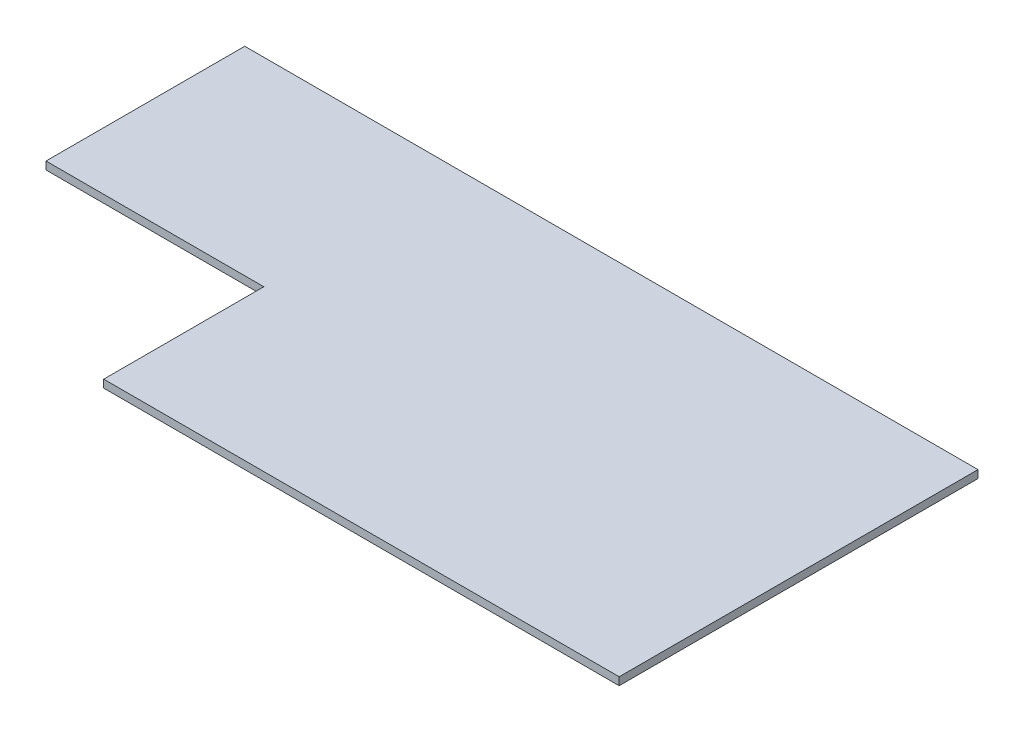
ISO-10303-21;
HEADER;
FILE_DESCRIPTION(('STEP AP214'),'2;1');
FILE_NAME('part.step','',(''),(''),'','','');
FILE_SCHEMA(('AUTOMOTIVE_DESIGN { 1 0 10303 214 1 1 1 1 }'));
ENDSEC;
DATA;
#1=APPLICATION_CONTEXT('core data for automotive mechanical design processes');
#2=APPLICATION_PROTOCOL_DEFINITION('international standard','automotive_design',2000,#1);
#3=PRODUCT_CONTEXT('',#1,'mechanical');
#4=PRODUCT('Part','Part','',(#3));
#5=PRODUCT_RELATED_PRODUCT_CATEGORY('part','',(#4));
#6=PRODUCT_DEFINITION_FORMATION('','',#4);
#7=PRODUCT_DEFINITION_CONTEXT('part definition',#1,'design');
#8=PRODUCT_DEFINITION('design','',#6,#7);
#9=PRODUCT_DEFINITION_SHAPE('','',#8);
#10=(LENGTH_UNIT() NAMED_UNIT(*) SI_UNIT(.MILLI.,.METRE.));
#11=(NAMED_UNIT(*) PLANE_ANGLE_UNIT() SI_UNIT($,.RADIAN.));
#12=(NAMED_UNIT(*) SI_UNIT($,.STERADIAN.) SOLID_ANGLE_UNIT());
#13=UNCERTAINTY_MEASURE_WITH_UNIT(LENGTH_MEASURE(1.E-05),#10,'distance_accuracy_value','');
#14=(GEOMETRIC_REPRESENTATION_CONTEXT(3) GLOBAL_UNCERTAINTY_ASSIGNED_CONTEXT((#13)) GLOBAL_UNIT_ASSIGNED_CONTEXT((#10,
#11,#12)) REPRESENTATION_CONTEXT('',''));
#15=CARTESIAN_POINT('',(0.,0.,0.));
#16=DIRECTION('',(0.,0.,1.));
#17=DIRECTION('',(1.,0.,0.));
#18=AXIS2_PLACEMENT_3D('',#15,#16,#17);
#19=CARTESIAN_POINT('',(296.021061623797,3.175,144.861370581858));
#20=DIRECTION('',(-1.,0.,0.));
#21=DIRECTION('',(0.,0.,1.));
#22=AXIS2_PLACEMENT_3D('',#19,#20,#21);
#23=PLANE('',#22);
#24=DIRECTION('',(0.,0.,-1.));
#25=VECTOR('',#24,1.);
#26=CARTESIAN_POINT('',(296.021061623797,-3.175,144.861370581858));
#27=LINE('',#26,#25);
#28=CARTESIAN_POINT('',(296.021061623797,-3.175,144.861370581858));
#29=VERTEX_POINT('',#28);
#30=CARTESIAN_POINT('',(296.021061623797,-3.175,-147.238629418142));
#31=VERTEX_POINT('',#30);
#32=EDGE_CURVE('E123',#29,#31,#27,.T.);
#33=ORIENTED_EDGE('',*,*,#32,.T.);
#34=DIRECTION('',(0.,-1.,0.));
#35=VECTOR('',#34,1.);
#36=CARTESIAN_POINT('',(296.021061623797,3.175,-147.238629418142));
#37=LINE('',#36,#35);
#38=CARTESIAN_POINT('',(296.021061623797,3.175,-147.238629418142));
#39=VERTEX_POINT('',#38);
#40=EDGE_CURVE('E11',#39,#31,#37,.T.);
#41=ORIENTED_EDGE('',*,*,#40,.F.);
#42=DIRECTION('',(0.,0.,-1.));
#43=VECTOR('',#42,1.);
#44=CARTESIAN_POINT('',(296.021061623797,3.175,144.861370581858));
#45=LINE('',#44,#43);
#46=CARTESIAN_POINT('',(296.021061623797,3.175,144.861370581858));
#47=VERTEX_POINT('',#46);
#48=EDGE_CURVE('E133',#47,#39,#45,.T.);
#49=ORIENTED_EDGE('',*,*,#48,.F.);
#50=DIRECTION('',(0.,-1.,0.));
#51=VECTOR('',#50,1.);
#52=CARTESIAN_POINT('',(296.021061623797,3.175,144.861370581858));
#53=LINE('',#52,#51);
#54=EDGE_CURVE('E119',#47,#29,#53,.T.);
#55=ORIENTED_EDGE('',*,*,#54,.T.);
#56=EDGE_LOOP('',(#33,#41,#49,#55));
#57=FACE_BOUND('',#56,.T.);
#58=ADVANCED_FACE('F39',(#57),#23,.F.);
#59=CARTESIAN_POINT('',(-300.878938376203,3.175,-147.238629418142));
#60=DIRECTION('',(0.,0.,1.));
#61=DIRECTION('',(1.,0.,0.));
#62=AXIS2_PLACEMENT_3D('',#59,#60,#61);
#63=PLANE('',#62);
#64=DIRECTION('',(-1.,0.,0.));
#65=VECTOR('',#64,1.);
#66=CARTESIAN_POINT('',(-300.878938376203,-3.175,-147.238629418142));
#67=LINE('',#66,#65);
#68=CARTESIAN_POINT('',(-300.878938376203,-3.175,-147.238629418142));
#69=VERTEX_POINT('',#68);
#70=EDGE_CURVE('E126',#31,#69,#67,.T.);
#71=ORIENTED_EDGE('',*,*,#70,.T.);
#72=DIRECTION('',(0.,-1.,0.));
#73=VECTOR('',#72,1.);
#74=CARTESIAN_POINT('',(-300.878938376203,3.175,-147.238629418142));
#75=LINE('',#74,#73);
#76=CARTESIAN_POINT('',(-300.878938376203,3.175,-147.238629418142));
#77=VERTEX_POINT('',#76);
#78=EDGE_CURVE('E47',#77,#69,#75,.T.);
#79=ORIENTED_EDGE('',*,*,#78,.F.);
#80=DIRECTION('',(-1.,0.,0.));
#81=VECTOR('',#80,1.);
#82=CARTESIAN_POINT('',(-300.878938376203,3.175,-147.238629418142));
#83=LINE('',#82,#81);
#84=EDGE_CURVE('E92',#39,#77,#83,.T.);
#85=ORIENTED_EDGE('',*,*,#84,.F.);
#86=ORIENTED_EDGE('',*,*,#40,.T.);
#87=EDGE_LOOP('',(#71,#79,#85,#86));
#88=FACE_BOUND('',#87,.T.);
#89=ADVANCED_FACE('F157',(#88),#63,.F.);
#90=CARTESIAN_POINT('',(-300.878938376203,3.175,14.5593705818583));
#91=DIRECTION('',(1.,0.,0.));
#92=DIRECTION('',(0.,0.,-1.));
#93=AXIS2_PLACEMENT_3D('',#90,#91,#92);
#94=PLANE('',#93);
#95=DIRECTION('',(0.,0.,1.));
#96=VECTOR('',#95,1.);
#97=CARTESIAN_POINT('',(-300.878938376203,-3.175,14.5593705818583));
#98=LINE('',#97,#96);
#99=CARTESIAN_POINT('',(-300.878938376203,-3.175,14.5593705818583));
#100=VERTEX_POINT('',#99);
#101=EDGE_CURVE('E128',#69,#100,#98,.T.);
#102=ORIENTED_EDGE('',*,*,#101,.T.);
#103=DIRECTION('',(0.,-1.,0.));
#104=VECTOR('',#103,1.);
#105=CARTESIAN_POINT('',(-300.878938376203,3.175,14.5593705818583));
#106=LINE('',#105,#104);
#107=CARTESIAN_POINT('',(-300.878938376203,3.175,14.5593705818583));
#108=VERTEX_POINT('',#107);
#109=EDGE_CURVE('E114',#108,#100,#106,.T.);
#110=ORIENTED_EDGE('',*,*,#109,.F.);
#111=DIRECTION('',(0.,0.,1.));
#112=VECTOR('',#111,1.);
#113=CARTESIAN_POINT('',(-300.878938376203,3.175,14.5593705818583));
#114=LINE('',#113,#112);
#115=EDGE_CURVE('E105',#77,#108,#114,.T.);
#116=ORIENTED_EDGE('',*,*,#115,.F.);
#117=ORIENTED_EDGE('',*,*,#78,.T.);
#118=EDGE_LOOP('',(#102,#110,#116,#117));
#119=FACE_BOUND('',#118,.T.);
#120=ADVANCED_FACE('F139',(#119),#94,.F.);
#121=CARTESIAN_POINT('',(-300.878938376203,3.175,14.5593705818583));
#122=DIRECTION('',(0.,0.,-1.));
#123=DIRECTION('',(-1.,0.,0.));
#124=AXIS2_PLACEMENT_3D('',#121,#122,#123);
#125=PLANE('',#124);
#126=DIRECTION('',(1.,0.,0.));
#127=VECTOR('',#126,1.);
#128=CARTESIAN_POINT('',(-300.878938376203,-3.175,14.5593705818583));
#129=LINE('',#128,#127);
#130=CARTESIAN_POINT('',(-123.586938376203,-3.175,14.5593705818583));
#131=VERTEX_POINT('',#130);
#132=EDGE_CURVE('E113',#100,#131,#129,.T.);
#133=ORIENTED_EDGE('',*,*,#132,.T.);
#134=DIRECTION('',(0.,-1.,0.));
#135=VECTOR('',#134,1.);
#136=CARTESIAN_POINT('',(-123.586938376203,3.175,14.5593705818583));
#137=LINE('',#136,#135);
#138=CARTESIAN_POINT('',(-123.586938376203,3.175,14.5593705818583));
#139=VERTEX_POINT('',#138);
#140=EDGE_CURVE('E110',#139,#131,#137,.T.);
#141=ORIENTED_EDGE('',*,*,#140,.F.);
#142=DIRECTION('',(1.,0.,0.));
#143=VECTOR('',#142,1.);
#144=CARTESIAN_POINT('',(-300.878938376203,3.175,14.5593705818583));
#145=LINE('',#144,#143);
#146=EDGE_CURVE('E99',#108,#139,#145,.T.);
#147=ORIENTED_EDGE('',*,*,#146,.F.);
#148=ORIENTED_EDGE('',*,*,#109,.T.);
#149=EDGE_LOOP('',(#133,#141,#147,#148));
#150=FACE_BOUND('',#149,.T.);
#151=ADVANCED_FACE('F111',(#150),#125,.F.);
#152=CARTESIAN_POINT('',(-123.586938376203,3.175,144.861370581858));
#153=DIRECTION('',(1.,0.,0.));
#154=DIRECTION('',(0.,0.,-1.));
#155=AXIS2_PLACEMENT_3D('',#152,#153,#154);
#156=PLANE('',#155);
#157=DIRECTION('',(0.,0.,1.));
#158=VECTOR('',#157,1.);
#159=CARTESIAN_POINT('',(-123.586938376203,-3.175,144.861370581858));
#160=LINE('',#159,#158);
#161=CARTESIAN_POINT('',(-123.586938376203,-3.175,144.861370581858));
#162=VERTEX_POINT('',#161);
#163=EDGE_CURVE('E78',#131,#162,#160,.T.);
#164=ORIENTED_EDGE('',*,*,#163,.T.);
#165=DIRECTION('',(0.,-1.,0.));
#166=VECTOR('',#165,1.);
#167=CARTESIAN_POINT('',(-123.586938376203,3.175,144.861370581858));
#168=LINE('',#167,#166);
#169=CARTESIAN_POINT('',(-123.586938376203,3.175,144.861370581858));
#170=VERTEX_POINT('',#169);
#171=EDGE_CURVE('E115',#170,#162,#168,.T.);
#172=ORIENTED_EDGE('',*,*,#171,.F.);
#173=DIRECTION('',(0.,0.,1.));
#174=VECTOR('',#173,1.);
#175=CARTESIAN_POINT('',(-123.586938376203,3.175,144.861370581858));
#176=LINE('',#175,#174);
#177=EDGE_CURVE('E103',#139,#170,#176,.T.);
#178=ORIENTED_EDGE('',*,*,#177,.F.);
#179=ORIENTED_EDGE('',*,*,#140,.T.);
#180=EDGE_LOOP('',(#164,#172,#178,#179));
#181=FACE_BOUND('',#180,.T.);
#182=ADVANCED_FACE('F117',(#181),#156,.F.);
#183=CARTESIAN_POINT('',(-123.586938376203,3.175,144.861370581858));
#184=DIRECTION('',(0.,0.,-1.));
#185=DIRECTION('',(-1.,0.,0.));
#186=AXIS2_PLACEMENT_3D('',#183,#184,#185);
#187=PLANE('',#186);
#188=DIRECTION('',(1.,0.,0.));
#189=VECTOR('',#188,1.);
#190=CARTESIAN_POINT('',(-123.586938376203,-3.175,144.861370581858));
#191=LINE('',#190,#189);
#192=EDGE_CURVE('E84',#162,#29,#191,.T.);
#193=ORIENTED_EDGE('',*,*,#192,.T.);
#194=ORIENTED_EDGE('',*,*,#54,.F.);
#195=DIRECTION('',(1.,0.,0.));
#196=VECTOR('',#195,1.);
#197=CARTESIAN_POINT('',(-123.586938376203,3.175,144.861370581858));
#198=LINE('',#197,#196);
#199=EDGE_CURVE('E55',#170,#47,#198,.T.);
#200=ORIENTED_EDGE('',*,*,#199,.F.);
#201=ORIENTED_EDGE('',*,*,#171,.T.);
#202=EDGE_LOOP('',(#193,#194,#200,#201));
#203=FACE_BOUND('',#202,.T.);
#204=ADVANCED_FACE('F146',(#203),#187,.F.);
#205=CARTESIAN_POINT('',(0.,3.175,0.));
#206=DIRECTION('',(0.,-1.,0.));
#207=DIRECTION('',(0.,0.,-1.));
#208=AXIS2_PLACEMENT_3D('',#205,#206,#207);
#209=PLANE('',#208);
#210=ORIENTED_EDGE('',*,*,#48,.T.);
#211=ORIENTED_EDGE('',*,*,#84,.T.);
#212=ORIENTED_EDGE('',*,*,#115,.T.);
#213=ORIENTED_EDGE('',*,*,#146,.T.);
#214=ORIENTED_EDGE('',*,*,#177,.T.);
#215=ORIENTED_EDGE('',*,*,#199,.T.);
#216=EDGE_LOOP('',(#210,#211,#212,#213,#214,#215));
#217=FACE_BOUND('',#216,.T.);
#218=ADVANCED_FACE('F101',(#217),#209,.F.);
#219=CARTESIAN_POINT('',(0.,-3.175,0.));
#220=DIRECTION('',(0.,-1.,0.));
#221=DIRECTION('',(0.,0.,-1.));
#222=AXIS2_PLACEMENT_3D('',#219,#220,#221);
#223=PLANE('',#222);
#224=ORIENTED_EDGE('',*,*,#32,.F.);
#225=ORIENTED_EDGE('',*,*,#192,.F.);
#226=ORIENTED_EDGE('',*,*,#163,.F.);
#227=ORIENTED_EDGE('',*,*,#132,.F.);
#228=ORIENTED_EDGE('',*,*,#101,.F.);
#229=ORIENTED_EDGE('',*,*,#70,.F.);
#230=EDGE_LOOP('',(#224,#225,#226,#227,#228,#229));
#231=FACE_BOUND('',#230,.T.);
#232=ADVANCED_FACE('F142',(#231),#223,.T.);
#233=CLOSED_SHELL('',(#58,#89,#120,#151,#182,#204,#218,#232));
#234=MANIFOLD_SOLID_BREP('B2',#233);
#235=ADVANCED_BREP_SHAPE_REPRESENTATION('',(#18,#234),#14);
#236=SHAPE_DEFINITION_REPRESENTATION(#9,#235);
ENDSEC;
END-ISO-10303-21;
